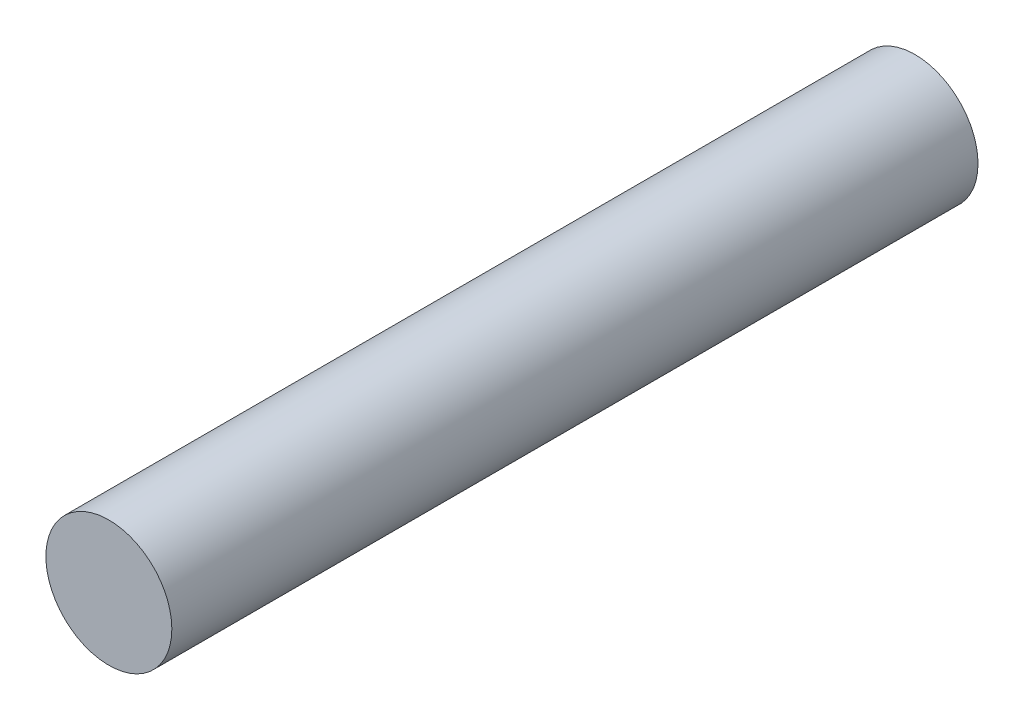
ISO-10303-21;
HEADER;
FILE_DESCRIPTION(('STEP AP214'),'2;1');
FILE_NAME('part.step','',(''),(''),'','','');
FILE_SCHEMA(('AUTOMOTIVE_DESIGN { 1 0 10303 214 1 1 1 1 }'));
ENDSEC;
DATA;
#1=APPLICATION_CONTEXT('core data for automotive mechanical design processes');
#2=APPLICATION_PROTOCOL_DEFINITION('international standard','automotive_design',2000,#1);
#3=PRODUCT_CONTEXT('',#1,'mechanical');
#4=PRODUCT('Part','Part','',(#3));
#5=PRODUCT_RELATED_PRODUCT_CATEGORY('part','',(#4));
#6=PRODUCT_DEFINITION_FORMATION('','',#4);
#7=PRODUCT_DEFINITION_CONTEXT('part definition',#1,'design');
#8=PRODUCT_DEFINITION('design','',#6,#7);
#9=PRODUCT_DEFINITION_SHAPE('','',#8);
#10=(LENGTH_UNIT() NAMED_UNIT(*) SI_UNIT(.MILLI.,.METRE.));
#11=(NAMED_UNIT(*) PLANE_ANGLE_UNIT() SI_UNIT($,.RADIAN.));
#12=(NAMED_UNIT(*) SI_UNIT($,.STERADIAN.) SOLID_ANGLE_UNIT());
#13=UNCERTAINTY_MEASURE_WITH_UNIT(LENGTH_MEASURE(1.E-05),#10,'distance_accuracy_value','');
#14=(GEOMETRIC_REPRESENTATION_CONTEXT(3) GLOBAL_UNCERTAINTY_ASSIGNED_CONTEXT((#13)) GLOBAL_UNIT_ASSIGNED_CONTEXT((#10,
#11,#12)) REPRESENTATION_CONTEXT('',''));
#15=CARTESIAN_POINT('',(0.,0.,0.));
#16=DIRECTION('',(0.,0.,1.));
#17=DIRECTION('',(1.,0.,0.));
#18=AXIS2_PLACEMENT_3D('',#15,#16,#17);
#19=CARTESIAN_POINT('',(0.,0.,160.));
#20=DIRECTION('',(0.,0.,-1.));
#21=DIRECTION('',(-1.,0.,0.));
#22=AXIS2_PLACEMENT_3D('',#19,#20,#21);
#23=CYLINDRICAL_SURFACE('',#22,12.5);
#24=CARTESIAN_POINT('',(0.,0.,160.));
#25=DIRECTION('',(0.,0.,1.));
#26=DIRECTION('',(1.,0.,0.));
#27=AXIS2_PLACEMENT_3D('',#24,#25,#26);
#28=CIRCLE('',#27,12.5);
#29=CARTESIAN_POINT('',(12.5,0.,160.));
#30=VERTEX_POINT('',#29);
#31=EDGE_CURVE('E10',#30,#30,#28,.T.);
#32=ORIENTED_EDGE('',*,*,#31,.F.);
#33=EDGE_LOOP('',(#32));
#34=FACE_BOUND('',#33,.T.);
#35=CARTESIAN_POINT('',(0.,0.,0.));
#36=DIRECTION('',(0.,0.,1.));
#37=DIRECTION('',(1.,0.,0.));
#38=AXIS2_PLACEMENT_3D('',#35,#36,#37);
#39=CIRCLE('',#38,12.5);
#40=CARTESIAN_POINT('',(12.5,0.,0.));
#41=VERTEX_POINT('',#40);
#42=EDGE_CURVE('E34',#41,#41,#39,.T.);
#43=ORIENTED_EDGE('',*,*,#42,.T.);
#44=EDGE_LOOP('',(#43));
#45=FACE_BOUND('',#44,.T.);
#46=ADVANCED_FACE('F31',(#34,#45),#23,.T.);
#47=CARTESIAN_POINT('',(0.,0.,160.));
#48=DIRECTION('',(0.,0.,1.));
#49=DIRECTION('',(1.,0.,0.));
#50=AXIS2_PLACEMENT_3D('',#47,#48,#49);
#51=PLANE('',#50);
#52=ORIENTED_EDGE('',*,*,#31,.T.);
#53=EDGE_LOOP('',(#52));
#54=FACE_BOUND('',#53,.T.);
#55=ADVANCED_FACE('F46',(#54),#51,.T.);
#56=CARTESIAN_POINT('',(0.,0.,0.));
#57=DIRECTION('',(0.,0.,1.));
#58=DIRECTION('',(1.,0.,0.));
#59=AXIS2_PLACEMENT_3D('',#56,#57,#58);
#60=PLANE('',#59);
#61=ORIENTED_EDGE('',*,*,#42,.F.);
#62=EDGE_LOOP('',(#61));
#63=FACE_BOUND('',#62,.T.);
#64=ADVANCED_FACE('F44',(#63),#60,.F.);
#65=CLOSED_SHELL('',(#46,#55,#64));
#66=MANIFOLD_SOLID_BREP('B2',#65);
#67=ADVANCED_BREP_SHAPE_REPRESENTATION('',(#18,#66),#14);
#68=SHAPE_DEFINITION_REPRESENTATION(#9,#67);
ENDSEC;
END-ISO-10303-21;
